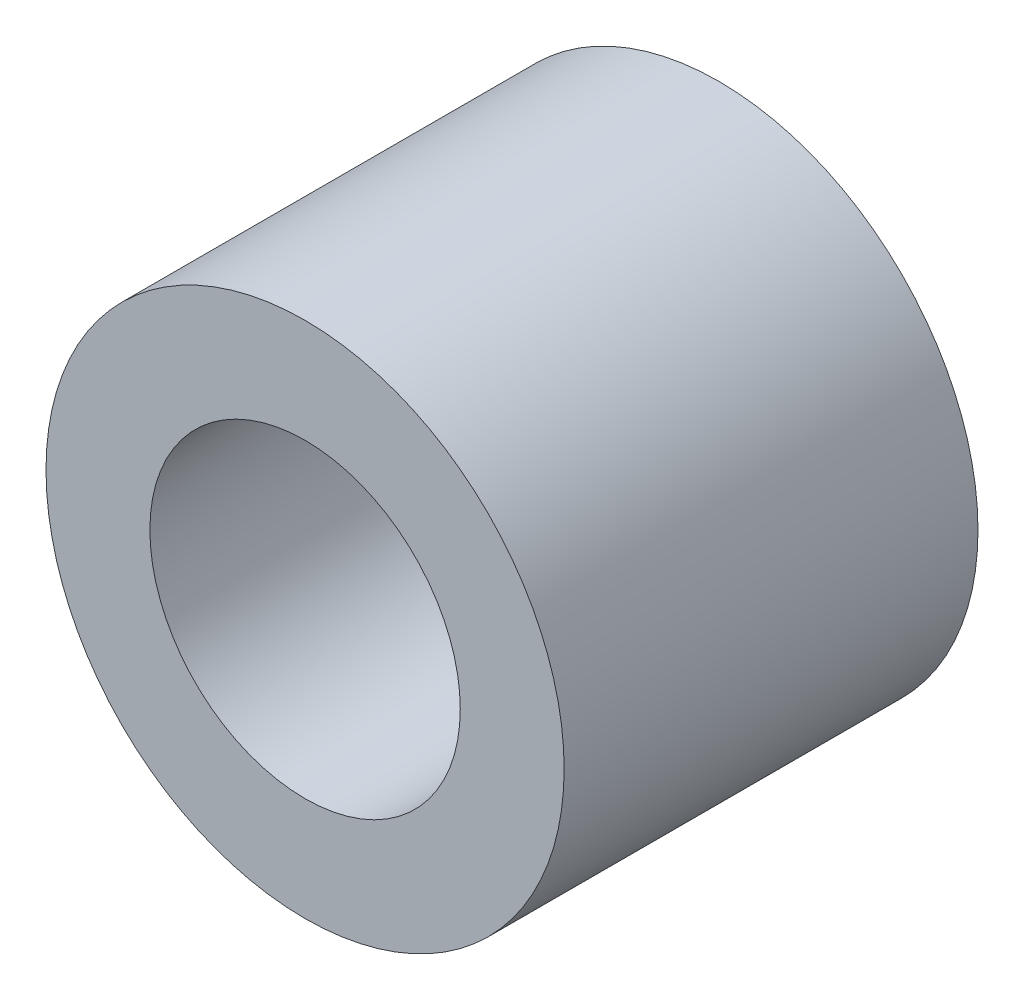
ISO-10303-21;
HEADER;
FILE_DESCRIPTION(('STEP AP214'),'2;1');
FILE_NAME('part.step','',(''),(''),'','','');
FILE_SCHEMA(('AUTOMOTIVE_DESIGN { 1 0 10303 214 1 1 1 1 }'));
ENDSEC;
DATA;
#1=APPLICATION_CONTEXT('core data for automotive mechanical design processes');
#2=APPLICATION_PROTOCOL_DEFINITION('international standard','automotive_design',2000,#1);
#3=PRODUCT_CONTEXT('',#1,'mechanical');
#4=PRODUCT('Part','Part','',(#3));
#5=PRODUCT_RELATED_PRODUCT_CATEGORY('part','',(#4));
#6=PRODUCT_DEFINITION_FORMATION('','',#4);
#7=PRODUCT_DEFINITION_CONTEXT('part definition',#1,'design');
#8=PRODUCT_DEFINITION('design','',#6,#7);
#9=PRODUCT_DEFINITION_SHAPE('','',#8);
#10=(LENGTH_UNIT() NAMED_UNIT(*) SI_UNIT(.MILLI.,.METRE.));
#11=(NAMED_UNIT(*) PLANE_ANGLE_UNIT() SI_UNIT($,.RADIAN.));
#12=(NAMED_UNIT(*) SI_UNIT($,.STERADIAN.) SOLID_ANGLE_UNIT());
#13=UNCERTAINTY_MEASURE_WITH_UNIT(LENGTH_MEASURE(1.E-05),#10,'distance_accuracy_value','');
#14=(GEOMETRIC_REPRESENTATION_CONTEXT(3) GLOBAL_UNCERTAINTY_ASSIGNED_CONTEXT((#13)) GLOBAL_UNIT_ASSIGNED_CONTEXT((#10,
#11,#12)) REPRESENTATION_CONTEXT('',''));
#15=CARTESIAN_POINT('',(0.,0.,0.));
#16=DIRECTION('',(0.,0.,1.));
#17=DIRECTION('',(1.,0.,0.));
#18=AXIS2_PLACEMENT_3D('',#15,#16,#17);
#19=CARTESIAN_POINT('',(0.,0.,6.35));
#20=DIRECTION('',(0.,0.,1.));
#21=DIRECTION('',(1.,0.,0.));
#22=AXIS2_PLACEMENT_3D('',#19,#20,#21);
#23=PLANE('',#22);
#24=CARTESIAN_POINT('',(0.,0.,6.35));
#25=DIRECTION('',(0.,0.,1.));
#26=DIRECTION('',(1.,0.,0.));
#27=AXIS2_PLACEMENT_3D('',#24,#25,#26);
#28=CIRCLE('',#27,7.9502);
#29=CARTESIAN_POINT('',(7.9502,0.,6.35));
#30=VERTEX_POINT('',#29);
#31=EDGE_CURVE('E10',#30,#30,#28,.T.);
#32=ORIENTED_EDGE('',*,*,#31,.T.);
#33=EDGE_LOOP('',(#32));
#34=FACE_BOUND('',#33,.T.);
#35=CARTESIAN_POINT('',(0.,0.,6.35));
#36=DIRECTION('',(0.,0.,1.));
#37=DIRECTION('',(1.,0.,0.));
#38=AXIS2_PLACEMENT_3D('',#35,#36,#37);
#39=CIRCLE('',#38,4.7625);
#40=CARTESIAN_POINT('',(4.7625,0.,6.35));
#41=VERTEX_POINT('',#40);
#42=EDGE_CURVE('E39',#41,#41,#39,.T.);
#43=ORIENTED_EDGE('',*,*,#42,.F.);
#44=EDGE_LOOP('',(#43));
#45=FACE_BOUND('',#44,.T.);
#46=ADVANCED_FACE('F32',(#34,#45),#23,.T.);
#47=CARTESIAN_POINT('',(0.,0.,6.35));
#48=DIRECTION('',(0.,0.,-1.));
#49=DIRECTION('',(-1.,0.,0.));
#50=AXIS2_PLACEMENT_3D('',#47,#48,#49);
#51=CYLINDRICAL_SURFACE('',#50,7.9502);
#52=ORIENTED_EDGE('',*,*,#31,.F.);
#53=EDGE_LOOP('',(#52));
#54=FACE_BOUND('',#53,.T.);
#55=CARTESIAN_POINT('',(0.,0.,-6.35));
#56=DIRECTION('',(0.,0.,1.));
#57=DIRECTION('',(1.,0.,0.));
#58=AXIS2_PLACEMENT_3D('',#55,#56,#57);
#59=CIRCLE('',#58,7.9502);
#60=CARTESIAN_POINT('',(7.9502,0.,-6.35));
#61=VERTEX_POINT('',#60);
#62=EDGE_CURVE('E43',#61,#61,#59,.T.);
#63=ORIENTED_EDGE('',*,*,#62,.T.);
#64=EDGE_LOOP('',(#63));
#65=FACE_BOUND('',#64,.T.);
#66=ADVANCED_FACE('F34',(#54,#65),#51,.T.);
#67=CARTESIAN_POINT('',(0.,0.,6.35));
#68=DIRECTION('',(0.,0.,-1.));
#69=DIRECTION('',(-1.,0.,0.));
#70=AXIS2_PLACEMENT_3D('',#67,#68,#69);
#71=CYLINDRICAL_SURFACE('',#70,4.7625);
#72=ORIENTED_EDGE('',*,*,#42,.T.);
#73=EDGE_LOOP('',(#72));
#74=FACE_BOUND('',#73,.T.);
#75=CARTESIAN_POINT('',(0.,0.,-6.35));
#76=DIRECTION('',(0.,0.,1.));
#77=DIRECTION('',(1.,0.,0.));
#78=AXIS2_PLACEMENT_3D('',#75,#76,#77);
#79=CIRCLE('',#78,4.7625);
#80=CARTESIAN_POINT('',(4.7625,0.,-6.35));
#81=VERTEX_POINT('',#80);
#82=EDGE_CURVE('E47',#81,#81,#79,.T.);
#83=ORIENTED_EDGE('',*,*,#82,.F.);
#84=EDGE_LOOP('',(#83));
#85=FACE_BOUND('',#84,.T.);
#86=ADVANCED_FACE('F56',(#74,#85),#71,.F.);
#87=CARTESIAN_POINT('',(0.,0.,-6.35));
#88=DIRECTION('',(0.,0.,1.));
#89=DIRECTION('',(1.,0.,0.));
#90=AXIS2_PLACEMENT_3D('',#87,#88,#89);
#91=PLANE('',#90);
#92=ORIENTED_EDGE('',*,*,#82,.T.);
#93=EDGE_LOOP('',(#92));
#94=FACE_BOUND('',#93,.T.);
#95=ORIENTED_EDGE('',*,*,#62,.F.);
#96=EDGE_LOOP('',(#95));
#97=FACE_BOUND('',#96,.T.);
#98=ADVANCED_FACE('F53',(#94,#97),#91,.F.);
#99=CLOSED_SHELL('',(#46,#66,#86,#98));
#100=MANIFOLD_SOLID_BREP('B2',#99);
#101=ADVANCED_BREP_SHAPE_REPRESENTATION('',(#18,#100),#14);
#102=SHAPE_DEFINITION_REPRESENTATION(#9,#101);
ENDSEC;
END-ISO-10303-21;
